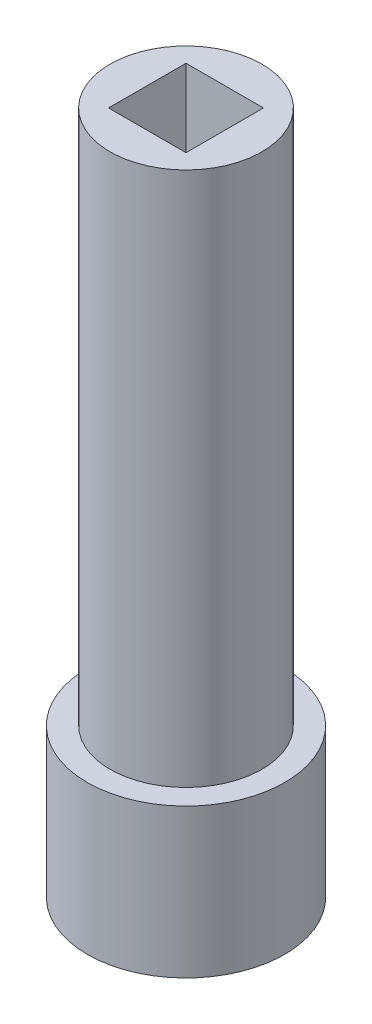
ISO-10303-21;
HEADER;
FILE_DESCRIPTION(('STEP AP214'),'2;1');
FILE_NAME('part.step','',(''),(''),'','','');
FILE_SCHEMA(('AUTOMOTIVE_DESIGN { 1 0 10303 214 1 1 1 1 }'));
ENDSEC;
DATA;
#1=APPLICATION_CONTEXT('core data for automotive mechanical design processes');
#2=APPLICATION_PROTOCOL_DEFINITION('international standard','automotive_design',2000,#1);
#3=PRODUCT_CONTEXT('',#1,'mechanical');
#4=PRODUCT('Part','Part','',(#3));
#5=PRODUCT_RELATED_PRODUCT_CATEGORY('part','',(#4));
#6=PRODUCT_DEFINITION_FORMATION('','',#4);
#7=PRODUCT_DEFINITION_CONTEXT('part definition',#1,'design');
#8=PRODUCT_DEFINITION('design','',#6,#7);
#9=PRODUCT_DEFINITION_SHAPE('','',#8);
#10=(LENGTH_UNIT() NAMED_UNIT(*) SI_UNIT(.MILLI.,.METRE.));
#11=(NAMED_UNIT(*) PLANE_ANGLE_UNIT() SI_UNIT($,.RADIAN.));
#12=(NAMED_UNIT(*) SI_UNIT($,.STERADIAN.) SOLID_ANGLE_UNIT());
#13=UNCERTAINTY_MEASURE_WITH_UNIT(LENGTH_MEASURE(1.E-05),#10,'distance_accuracy_value','');
#14=(GEOMETRIC_REPRESENTATION_CONTEXT(3) GLOBAL_UNCERTAINTY_ASSIGNED_CONTEXT((#13)) GLOBAL_UNIT_ASSIGNED_CONTEXT((#10,
#11,#12)) REPRESENTATION_CONTEXT('',''));
#15=CARTESIAN_POINT('',(0.,0.,0.));
#16=DIRECTION('',(0.,0.,1.));
#17=DIRECTION('',(1.,0.,0.));
#18=AXIS2_PLACEMENT_3D('',#15,#16,#17);
#19=CARTESIAN_POINT('',(0.,45.,0.));
#20=DIRECTION('',(0.,-1.,0.));
#21=DIRECTION('',(0.,0.,-1.));
#22=AXIS2_PLACEMENT_3D('',#19,#20,#21);
#23=CYLINDRICAL_SURFACE('',#22,5.);
#24=CARTESIAN_POINT('',(0.,45.,0.));
#25=DIRECTION('',(0.,1.,0.));
#26=DIRECTION('',(0.,0.,1.));
#27=AXIS2_PLACEMENT_3D('',#24,#25,#26);
#28=CIRCLE('',#27,5.);
#29=CARTESIAN_POINT('',(0.,45.,-5.));
#30=VERTEX_POINT('',#29);
#31=EDGE_CURVE('E47',#30,#30,#28,.T.);
#32=CARTESIAN_POINT('',(0.,9.8,0.));
#33=DIRECTION('',(0.,-1.,0.));
#34=DIRECTION('',(0.,0.,-1.));
#35=AXIS2_PLACEMENT_3D('',#32,#33,#34);
#36=CIRCLE('',#35,5.);
#37=CARTESIAN_POINT('',(0.,9.80000000000001,-5.));
#38=VERTEX_POINT('',#37);
#39=EDGE_CURVE('E11',#38,#38,#36,.T.);
#40=CARTESIAN_POINT('',(0.,45.,-5.));
#41=CARTESIAN_POINT('',(0.,44.6333333333333,-5.));
#42=CARTESIAN_POINT('',(0.,44.2666666666667,-5.));
#43=CARTESIAN_POINT('',(0.,43.5333333333333,-5.));
#44=CARTESIAN_POINT('',(0.,43.1666666666667,-5.));
#45=CARTESIAN_POINT('',(0.,42.4333333333333,-5.));
#46=CARTESIAN_POINT('',(0.,42.0666666666667,-5.));
#47=CARTESIAN_POINT('',(0.,41.3333333333333,-5.));
#48=CARTESIAN_POINT('',(0.,40.9666666666667,-5.));
#49=CARTESIAN_POINT('',(0.,40.2333333333333,-5.));
#50=CARTESIAN_POINT('',(0.,39.8666666666667,-5.));
#51=CARTESIAN_POINT('',(0.,39.1333333333333,-5.));
#52=CARTESIAN_POINT('',(0.,38.7666666666667,-5.));
#53=CARTESIAN_POINT('',(0.,38.0333333333333,-5.));
#54=CARTESIAN_POINT('',(0.,37.6666666666667,-5.));
#55=CARTESIAN_POINT('',(0.,36.9333333333333,-5.));
#56=CARTESIAN_POINT('',(0.,36.5666666666667,-5.));
#57=CARTESIAN_POINT('',(0.,35.8333333333333,-5.));
#58=CARTESIAN_POINT('',(0.,35.4666666666667,-5.));
#59=CARTESIAN_POINT('',(0.,34.7333333333333,-5.));
#60=CARTESIAN_POINT('',(0.,34.3666666666667,-5.));
#61=CARTESIAN_POINT('',(0.,33.6333333333333,-5.));
#62=CARTESIAN_POINT('',(0.,33.2666666666667,-5.));
#63=CARTESIAN_POINT('',(0.,32.5333333333333,-5.));
#64=CARTESIAN_POINT('',(0.,32.1666666666667,-5.));
#65=CARTESIAN_POINT('',(0.,31.4333333333333,-5.));
#66=CARTESIAN_POINT('',(0.,31.0666666666667,-5.));
#67=CARTESIAN_POINT('',(0.,30.3333333333333,-5.));
#68=CARTESIAN_POINT('',(0.,29.9666666666667,-5.));
#69=CARTESIAN_POINT('',(0.,29.2333333333333,-5.));
#70=CARTESIAN_POINT('',(0.,28.8666666666667,-5.));
#71=CARTESIAN_POINT('',(0.,28.1333333333333,-5.));
#72=CARTESIAN_POINT('',(0.,27.7666666666667,-5.));
#73=CARTESIAN_POINT('',(0.,27.0333333333333,-5.));
#74=CARTESIAN_POINT('',(0.,26.6666666666667,-5.));
#75=CARTESIAN_POINT('',(0.,25.9333333333333,-5.));
#76=CARTESIAN_POINT('',(0.,25.5666666666667,-5.));
#77=CARTESIAN_POINT('',(0.,24.8333333333333,-5.));
#78=CARTESIAN_POINT('',(0.,24.4666666666667,-5.));
#79=CARTESIAN_POINT('',(0.,23.7333333333333,-5.));
#80=CARTESIAN_POINT('',(0.,23.3666666666667,-5.));
#81=CARTESIAN_POINT('',(0.,22.6333333333333,-5.));
#82=CARTESIAN_POINT('',(0.,22.2666666666667,-5.));
#83=CARTESIAN_POINT('',(0.,21.5333333333333,-5.));
#84=CARTESIAN_POINT('',(0.,21.1666666666667,-5.));
#85=CARTESIAN_POINT('',(0.,20.4333333333333,-5.));
#86=CARTESIAN_POINT('',(0.,20.0666666666667,-5.));
#87=CARTESIAN_POINT('',(0.,19.3333333333333,-5.));
#88=CARTESIAN_POINT('',(0.,18.9666666666667,-5.));
#89=CARTESIAN_POINT('',(0.,18.2333333333333,-5.));
#90=CARTESIAN_POINT('',(0.,17.8666666666667,-5.));
#91=CARTESIAN_POINT('',(0.,17.1333333333333,-5.));
#92=CARTESIAN_POINT('',(0.,16.7666666666667,-5.));
#93=CARTESIAN_POINT('',(0.,16.0333333333333,-5.));
#94=CARTESIAN_POINT('',(0.,15.6666666666667,-5.));
#95=CARTESIAN_POINT('',(0.,14.9333333333333,-5.));
#96=CARTESIAN_POINT('',(0.,14.5666666666667,-5.));
#97=CARTESIAN_POINT('',(0.,13.8333333333333,-5.));
#98=CARTESIAN_POINT('',(0.,13.4666666666667,-5.));
#99=CARTESIAN_POINT('',(0.,12.7333333333333,-5.));
#100=CARTESIAN_POINT('',(0.,12.3666666666667,-5.));
#101=CARTESIAN_POINT('',(0.,11.6333333333333,-5.));
#102=CARTESIAN_POINT('',(0.,11.2666666666667,-5.));
#103=CARTESIAN_POINT('',(0.,10.5333333333333,-5.));
#104=CARTESIAN_POINT('',(0.,10.1666666666667,-5.));
#105=CARTESIAN_POINT('',(0.,9.80000000000001,-5.));
#106=B_SPLINE_CURVE_WITH_KNOTS('',3,(#40,#41,#42,#43,#44,#45,#46,#47,#48,#49,#50,#51,#52,#53,
#54,#55,#56,#57,#58,#59,#60,#61,#62,#63,#64,#65,#66,#67,#68,#69,#70,#71,#72,#73,#74,#75,#76,#77,
#78,#79,#80,#81,#82,#83,#84,#85,#86,#87,#88,#89,#90,#91,#92,#93,#94,#95,#96,#97,#98,#99,#100,
#101,#102,#103,#104,#105),.UNSPECIFIED.,.F.,.F.,(4,2,2,2,2,2,2,2,2,2,2,2,2,2,2,2,2,2,2,2,2,2,2,
2,2,2,2,2,2,2,2,2,4),(0.,1.1,2.19999999999999,3.3,4.39999999999999,5.49999999999999,
6.59999999999999,7.69999999999999,8.8,9.89999999999999,11.,12.1,13.2,14.3,15.4,16.5,17.6,18.7,
19.8,20.9,22.,23.1,24.2,25.3,26.4,27.5,28.6,29.7,30.8,31.9,33.,34.1,35.2),.UNSPECIFIED.);
#107=EDGE_CURVE('BSEAM39',#30,#38,#106,.T.);
#108=ORIENTED_EDGE('',*,*,#31,.F.);
#109=ORIENTED_EDGE('',*,*,#39,.F.);
#110=ORIENTED_EDGE('',*,*,#107,.T.);
#111=ORIENTED_EDGE('',*,*,#107,.F.);
#112=EDGE_LOOP('',(#108,#110,#109,#111));
#113=FACE_BOUND('',#112,.T.);
#114=ADVANCED_FACE('F39',(#113),#23,.T.);
#115=CARTESIAN_POINT('',(0.,45.,0.));
#116=DIRECTION('',(0.,1.,0.));
#117=DIRECTION('',(0.,0.,1.));
#118=AXIS2_PLACEMENT_3D('',#115,#116,#117);
#119=PLANE('',#118);
#120=DIRECTION('',(0.,0.,1.));
#121=VECTOR('',#120,1.);
#122=CARTESIAN_POINT('',(-2.55,45.,-2.55));
#123=LINE('',#122,#121);
#124=CARTESIAN_POINT('',(-2.55,45.,-2.55));
#125=VERTEX_POINT('',#124);
#126=CARTESIAN_POINT('',(-2.55,45.,2.55));
#127=VERTEX_POINT('',#126);
#128=EDGE_CURVE('E54',#125,#127,#123,.T.);
#129=ORIENTED_EDGE('',*,*,#128,.F.);
#130=DIRECTION('',(-1.,0.,0.));
#131=VECTOR('',#130,1.);
#132=CARTESIAN_POINT('',(-2.55,45.,-2.55));
#133=LINE('',#132,#131);
#134=CARTESIAN_POINT('',(2.55,45.,-2.55));
#135=VERTEX_POINT('',#134);
#136=EDGE_CURVE('E109',#135,#125,#133,.T.);
#137=ORIENTED_EDGE('',*,*,#136,.F.);
#138=DIRECTION('',(0.,0.,-1.));
#139=VECTOR('',#138,1.);
#140=CARTESIAN_POINT('',(2.55,45.,-2.55));
#141=LINE('',#140,#139);
#142=CARTESIAN_POINT('',(2.55,45.,2.55));
#143=VERTEX_POINT('',#142);
#144=EDGE_CURVE('E120',#143,#135,#141,.T.);
#145=ORIENTED_EDGE('',*,*,#144,.F.);
#146=DIRECTION('',(1.,0.,0.));
#147=VECTOR('',#146,1.);
#148=CARTESIAN_POINT('',(-2.55,45.,2.55));
#149=LINE('',#148,#147);
#150=EDGE_CURVE('E89',#127,#143,#149,.T.);
#151=ORIENTED_EDGE('',*,*,#150,.F.);
#152=EDGE_LOOP('',(#129,#137,#145,#151));
#153=FACE_BOUND('',#152,.T.);
#154=ORIENTED_EDGE('',*,*,#31,.T.);
#155=EDGE_LOOP('',(#154));
#156=FACE_BOUND('',#155,.T.);
#157=ADVANCED_FACE('F134',(#153,#156),#119,.T.);
#158=CARTESIAN_POINT('',(-2.55,23.,-2.55));
#159=DIRECTION('',(-1.,0.,0.));
#160=DIRECTION('',(0.,0.,1.));
#161=AXIS2_PLACEMENT_3D('',#158,#159,#160);
#162=PLANE('',#161);
#163=ORIENTED_EDGE('',*,*,#128,.T.);
#164=DIRECTION('',(0.,1.,0.));
#165=VECTOR('',#164,1.);
#166=CARTESIAN_POINT('',(-2.55,23.,2.55));
#167=LINE('',#166,#165);
#168=CARTESIAN_POINT('',(-2.55,23.,2.55));
#169=VERTEX_POINT('',#168);
#170=EDGE_CURVE('E77',#169,#127,#167,.T.);
#171=ORIENTED_EDGE('',*,*,#170,.F.);
#172=DIRECTION('',(0.,0.,1.));
#173=VECTOR('',#172,1.);
#174=CARTESIAN_POINT('',(-2.55,23.,-2.55));
#175=LINE('',#174,#173);
#176=CARTESIAN_POINT('',(-2.55,23.,-2.55));
#177=VERTEX_POINT('',#176);
#178=EDGE_CURVE('E105',#177,#169,#175,.T.);
#179=ORIENTED_EDGE('',*,*,#178,.F.);
#180=DIRECTION('',(0.,1.,0.));
#181=VECTOR('',#180,1.);
#182=CARTESIAN_POINT('',(-2.55,23.,-2.55));
#183=LINE('',#182,#181);
#184=EDGE_CURVE('E62',#177,#125,#183,.T.);
#185=ORIENTED_EDGE('',*,*,#184,.T.);
#186=EDGE_LOOP('',(#163,#171,#179,#185));
#187=FACE_BOUND('',#186,.T.);
#188=ADVANCED_FACE('F167',(#187),#162,.F.);
#189=CARTESIAN_POINT('',(-2.55,23.,-2.55));
#190=DIRECTION('',(0.,0.,-1.));
#191=DIRECTION('',(-1.,0.,0.));
#192=AXIS2_PLACEMENT_3D('',#189,#190,#191);
#193=PLANE('',#192);
#194=ORIENTED_EDGE('',*,*,#136,.T.);
#195=ORIENTED_EDGE('',*,*,#184,.F.);
#196=DIRECTION('',(-1.,0.,0.));
#197=VECTOR('',#196,1.);
#198=CARTESIAN_POINT('',(-2.55,23.,-2.55));
#199=LINE('',#198,#197);
#200=CARTESIAN_POINT('',(2.55,23.,-2.55));
#201=VERTEX_POINT('',#200);
#202=EDGE_CURVE('E102',#201,#177,#199,.T.);
#203=ORIENTED_EDGE('',*,*,#202,.F.);
#204=DIRECTION('',(0.,1.,0.));
#205=VECTOR('',#204,1.);
#206=CARTESIAN_POINT('',(2.55,23.,-2.55));
#207=LINE('',#206,#205);
#208=EDGE_CURVE('E94',#201,#135,#207,.T.);
#209=ORIENTED_EDGE('',*,*,#208,.T.);
#210=EDGE_LOOP('',(#194,#195,#203,#209));
#211=FACE_BOUND('',#210,.T.);
#212=ADVANCED_FACE('F164',(#211),#193,.F.);
#213=CARTESIAN_POINT('',(2.55,23.,-2.55));
#214=DIRECTION('',(1.,0.,0.));
#215=DIRECTION('',(0.,0.,-1.));
#216=AXIS2_PLACEMENT_3D('',#213,#214,#215);
#217=PLANE('',#216);
#218=ORIENTED_EDGE('',*,*,#144,.T.);
#219=ORIENTED_EDGE('',*,*,#208,.F.);
#220=DIRECTION('',(0.,0.,-1.));
#221=VECTOR('',#220,1.);
#222=CARTESIAN_POINT('',(2.55,23.,-2.55));
#223=LINE('',#222,#221);
#224=CARTESIAN_POINT('',(2.55,23.,2.55));
#225=VERTEX_POINT('',#224);
#226=EDGE_CURVE('E97',#225,#201,#223,.T.);
#227=ORIENTED_EDGE('',*,*,#226,.F.);
#228=DIRECTION('',(0.,1.,0.));
#229=VECTOR('',#228,1.);
#230=CARTESIAN_POINT('',(2.55,23.,2.55));
#231=LINE('',#230,#229);
#232=EDGE_CURVE('E82',#225,#143,#231,.T.);
#233=ORIENTED_EDGE('',*,*,#232,.T.);
#234=EDGE_LOOP('',(#218,#219,#227,#233));
#235=FACE_BOUND('',#234,.T.);
#236=ADVANCED_FACE('F98',(#235),#217,.F.);
#237=CARTESIAN_POINT('',(-2.55,23.,2.55));
#238=DIRECTION('',(0.,0.,1.));
#239=DIRECTION('',(1.,0.,0.));
#240=AXIS2_PLACEMENT_3D('',#237,#238,#239);
#241=PLANE('',#240);
#242=ORIENTED_EDGE('',*,*,#150,.T.);
#243=ORIENTED_EDGE('',*,*,#232,.F.);
#244=DIRECTION('',(1.,0.,0.));
#245=VECTOR('',#244,1.);
#246=CARTESIAN_POINT('',(-2.55,23.,2.55));
#247=LINE('',#246,#245);
#248=EDGE_CURVE('E86',#169,#225,#247,.T.);
#249=ORIENTED_EDGE('',*,*,#248,.F.);
#250=ORIENTED_EDGE('',*,*,#170,.T.);
#251=EDGE_LOOP('',(#242,#243,#249,#250));
#252=FACE_BOUND('',#251,.T.);
#253=ADVANCED_FACE('F84',(#252),#241,.F.);
#254=CARTESIAN_POINT('',(0.,23.,0.));
#255=DIRECTION('',(0.,1.,0.));
#256=DIRECTION('',(0.,0.,1.));
#257=AXIS2_PLACEMENT_3D('',#254,#255,#256);
#258=PLANE('',#257);
#259=ORIENTED_EDGE('',*,*,#178,.T.);
#260=ORIENTED_EDGE('',*,*,#248,.T.);
#261=ORIENTED_EDGE('',*,*,#226,.T.);
#262=ORIENTED_EDGE('',*,*,#202,.T.);
#263=EDGE_LOOP('',(#259,#260,#261,#262));
#264=FACE_BOUND('',#263,.T.);
#265=ADVANCED_FACE('F104',(#264),#258,.T.);
#266=CARTESIAN_POINT('',(0.,9.8,0.));
#267=DIRECTION('',(0.,-1.,0.));
#268=DIRECTION('',(0.,0.,-1.));
#269=AXIS2_PLACEMENT_3D('',#266,#267,#268);
#270=CYLINDRICAL_SURFACE('',#269,6.5);
#271=CARTESIAN_POINT('',(0.,9.8,0.));
#272=DIRECTION('',(0.,-1.,0.));
#273=DIRECTION('',(0.,0.,-1.));
#274=AXIS2_PLACEMENT_3D('',#271,#272,#273);
#275=CIRCLE('',#274,6.5);
#276=CARTESIAN_POINT('',(0.,9.8,-6.5));
#277=VERTEX_POINT('',#276);
#278=EDGE_CURVE('E117',#277,#277,#275,.T.);
#279=ORIENTED_EDGE('',*,*,#278,.T.);
#280=EDGE_LOOP('',(#279));
#281=FACE_BOUND('',#280,.T.);
#282=CARTESIAN_POINT('',(0.,0.,0.));
#283=DIRECTION('',(0.,-1.,0.));
#284=DIRECTION('',(0.,0.,-1.));
#285=AXIS2_PLACEMENT_3D('',#282,#283,#284);
#286=CIRCLE('',#285,6.5);
#287=CARTESIAN_POINT('',(0.,0.,-6.5));
#288=VERTEX_POINT('',#287);
#289=EDGE_CURVE('E150',#288,#288,#286,.T.);
#290=ORIENTED_EDGE('',*,*,#289,.F.);
#291=EDGE_LOOP('',(#290));
#292=FACE_BOUND('',#291,.T.);
#293=ADVANCED_FACE('F144',(#281,#292),#270,.T.);
#294=CARTESIAN_POINT('',(0.,9.8,0.));
#295=DIRECTION('',(0.,-1.,0.));
#296=DIRECTION('',(0.,0.,-1.));
#297=AXIS2_PLACEMENT_3D('',#294,#295,#296);
#298=PLANE('',#297);
#299=ORIENTED_EDGE('',*,*,#39,.T.);
#300=EDGE_LOOP('',(#299));
#301=FACE_BOUND('',#300,.T.);
#302=ORIENTED_EDGE('',*,*,#278,.F.);
#303=EDGE_LOOP('',(#302));
#304=FACE_BOUND('',#303,.T.);
#305=ADVANCED_FACE('F140',(#301,#304),#298,.F.);
#306=CARTESIAN_POINT('',(0.,0.,0.));
#307=DIRECTION('',(0.,1.,0.));
#308=DIRECTION('',(0.,0.,1.));
#309=AXIS2_PLACEMENT_3D('',#306,#307,#308);
#310=PLANE('',#309);
#311=ORIENTED_EDGE('',*,*,#289,.T.);
#312=EDGE_LOOP('',(#311));
#313=FACE_BOUND('',#312,.T.);
#314=ADVANCED_FACE('F143',(#313),#310,.F.);
#315=CLOSED_SHELL('',(#114,#157,#188,#212,#236,#253,#265,#293,#305,#314));
#316=MANIFOLD_SOLID_BREP('B2',#315);
#317=ADVANCED_BREP_SHAPE_REPRESENTATION('',(#18,#316),#14);
#318=SHAPE_DEFINITION_REPRESENTATION(#9,#317);
ENDSEC;
END-ISO-10303-21;
